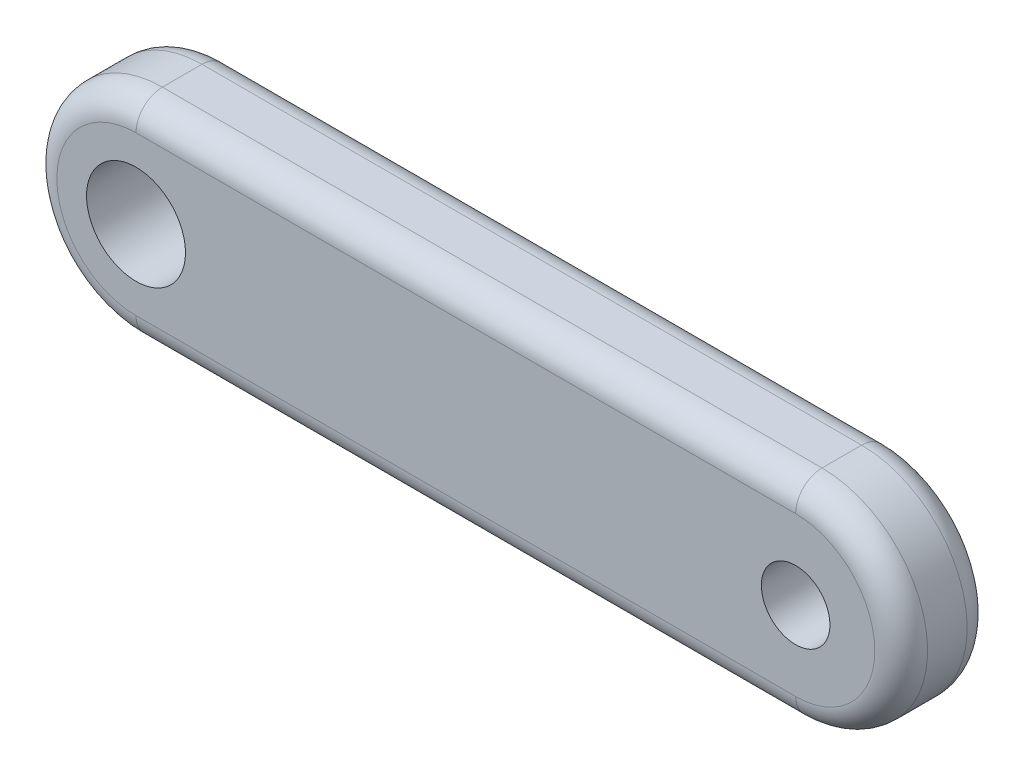
ISO-10303-21;
HEADER;
FILE_DESCRIPTION(('STEP AP214'),'2;1');
FILE_NAME('part.step','',(''),(''),'','','');
FILE_SCHEMA(('AUTOMOTIVE_DESIGN { 1 0 10303 214 1 1 1 1 }'));
ENDSEC;
DATA;
#1=APPLICATION_CONTEXT('core data for automotive mechanical design processes');
#2=APPLICATION_PROTOCOL_DEFINITION('international standard','automotive_design',2000,#1);
#3=PRODUCT_CONTEXT('',#1,'mechanical');
#4=PRODUCT('Part','Part','',(#3));
#5=PRODUCT_RELATED_PRODUCT_CATEGORY('part','',(#4));
#6=PRODUCT_DEFINITION_FORMATION('','',#4);
#7=PRODUCT_DEFINITION_CONTEXT('part definition',#1,'design');
#8=PRODUCT_DEFINITION('design','',#6,#7);
#9=PRODUCT_DEFINITION_SHAPE('','',#8);
#10=(LENGTH_UNIT() NAMED_UNIT(*) SI_UNIT(.MILLI.,.METRE.));
#11=(NAMED_UNIT(*) PLANE_ANGLE_UNIT() SI_UNIT($,.RADIAN.));
#12=(NAMED_UNIT(*) SI_UNIT($,.STERADIAN.) SOLID_ANGLE_UNIT());
#13=UNCERTAINTY_MEASURE_WITH_UNIT(LENGTH_MEASURE(1.E-05),#10,'distance_accuracy_value','');
#14=(GEOMETRIC_REPRESENTATION_CONTEXT(3) GLOBAL_UNCERTAINTY_ASSIGNED_CONTEXT((#13)) GLOBAL_UNIT_ASSIGNED_CONTEXT((#10,
#11,#12)) REPRESENTATION_CONTEXT('',''));
#15=CARTESIAN_POINT('',(0.,0.,0.));
#16=DIRECTION('',(0.,0.,1.));
#17=DIRECTION('',(1.,0.,0.));
#18=AXIS2_PLACEMENT_3D('',#15,#16,#17);
#19=CARTESIAN_POINT('',(0.,0.,4.445));
#20=DIRECTION('',(0.,0.,1.));
#21=DIRECTION('',(1.,0.,0.));
#22=AXIS2_PLACEMENT_3D('',#19,#20,#21);
#23=PLANE('',#22);
#24=DIRECTION('',(1.,0.,0.));
#25=VECTOR('',#24,1.);
#26=CARTESIAN_POINT('',(31.75,-3.81,4.445));
#27=LINE('',#26,#25);
#28=CARTESIAN_POINT('',(0.,-3.81,4.445));
#29=VERTEX_POINT('',#28);
#30=CARTESIAN_POINT('',(31.75,-3.81,4.445));
#31=VERTEX_POINT('',#30);
#32=EDGE_CURVE('E57',#29,#31,#27,.T.);
#33=ORIENTED_EDGE('',*,*,#32,.T.);
#34=CARTESIAN_POINT('',(31.75,0.,4.445));
#35=DIRECTION('',(0.,0.,1.));
#36=DIRECTION('',(1.,0.,0.));
#37=AXIS2_PLACEMENT_3D('',#34,#35,#36);
#38=CIRCLE('',#37,3.81);
#39=CARTESIAN_POINT('',(31.75,3.81,4.445));
#40=VERTEX_POINT('',#39);
#41=EDGE_CURVE('E117',#31,#40,#38,.T.);
#42=ORIENTED_EDGE('',*,*,#41,.T.);
#43=DIRECTION('',(-1.,0.,0.));
#44=VECTOR('',#43,1.);
#45=CARTESIAN_POINT('',(0.,3.81,4.445));
#46=LINE('',#45,#44);
#47=CARTESIAN_POINT('',(0.,3.81,4.445));
#48=VERTEX_POINT('',#47);
#49=EDGE_CURVE('E143',#40,#48,#46,.T.);
#50=ORIENTED_EDGE('',*,*,#49,.T.);
#51=CARTESIAN_POINT('',(0.,0.,4.445));
#52=DIRECTION('',(0.,0.,1.));
#53=DIRECTION('',(1.,0.,0.));
#54=AXIS2_PLACEMENT_3D('',#51,#52,#53);
#55=CIRCLE('',#54,3.81);
#56=EDGE_CURVE('E62',#48,#29,#55,.T.);
#57=ORIENTED_EDGE('',*,*,#56,.T.);
#58=EDGE_LOOP('',(#33,#42,#50,#57));
#59=FACE_BOUND('',#58,.T.);
#60=CARTESIAN_POINT('',(0.,0.,4.445));
#61=DIRECTION('',(0.,0.,1.));
#62=DIRECTION('',(1.,0.,0.));
#63=AXIS2_PLACEMENT_3D('',#60,#61,#62);
#64=CIRCLE('',#63,2.38125);
#65=CARTESIAN_POINT('',(2.38125,0.,4.445));
#66=VERTEX_POINT('',#65);
#67=EDGE_CURVE('E190',#66,#66,#64,.T.);
#68=ORIENTED_EDGE('',*,*,#67,.F.);
#69=EDGE_LOOP('',(#68));
#70=FACE_BOUND('',#69,.T.);
#71=CARTESIAN_POINT('',(31.75,0.,4.445));
#72=DIRECTION('',(0.,0.,1.));
#73=DIRECTION('',(1.,0.,0.));
#74=AXIS2_PLACEMENT_3D('',#71,#72,#73);
#75=CIRCLE('',#74,1.651);
#76=CARTESIAN_POINT('',(33.401,0.,4.445));
#77=VERTEX_POINT('',#76);
#78=EDGE_CURVE('E181',#77,#77,#75,.T.);
#79=ORIENTED_EDGE('',*,*,#78,.F.);
#80=EDGE_LOOP('',(#79));
#81=FACE_BOUND('',#80,.T.);
#82=ADVANCED_FACE('F39',(#59,#70,#81),#23,.T.);
#83=CARTESIAN_POINT('',(0.,0.,0.));
#84=DIRECTION('',(0.,0.,1.));
#85=DIRECTION('',(1.,0.,0.));
#86=AXIS2_PLACEMENT_3D('',#83,#84,#85);
#87=PLANE('',#86);
#88=DIRECTION('',(-1.,0.,0.));
#89=VECTOR('',#88,1.);
#90=CARTESIAN_POINT('',(0.,3.81,0.));
#91=LINE('',#90,#89);
#92=CARTESIAN_POINT('',(0.,3.81,0.));
#93=VERTEX_POINT('',#92);
#94=CARTESIAN_POINT('',(31.75,3.81,0.));
#95=VERTEX_POINT('',#94);
#96=EDGE_CURVE('E206',#93,#95,#91,.F.);
#97=ORIENTED_EDGE('',*,*,#96,.T.);
#98=CARTESIAN_POINT('',(31.75,0.,0.));
#99=DIRECTION('',(0.,0.,1.));
#100=DIRECTION('',(1.,0.,0.));
#101=AXIS2_PLACEMENT_3D('',#98,#99,#100);
#102=CIRCLE('',#101,3.81);
#103=CARTESIAN_POINT('',(31.75,-3.81,0.));
#104=VERTEX_POINT('',#103);
#105=EDGE_CURVE('E215',#95,#104,#102,.F.);
#106=ORIENTED_EDGE('',*,*,#105,.T.);
#107=DIRECTION('',(1.,0.,0.));
#108=VECTOR('',#107,1.);
#109=CARTESIAN_POINT('',(0.,-3.81,0.));
#110=LINE('',#109,#108);
#111=CARTESIAN_POINT('',(0.,-3.81,0.));
#112=VERTEX_POINT('',#111);
#113=EDGE_CURVE('E212',#104,#112,#110,.F.);
#114=ORIENTED_EDGE('',*,*,#113,.T.);
#115=CARTESIAN_POINT('',(0.,0.,0.));
#116=DIRECTION('',(0.,0.,1.));
#117=DIRECTION('',(1.,0.,0.));
#118=AXIS2_PLACEMENT_3D('',#115,#116,#117);
#119=CIRCLE('',#118,3.81);
#120=EDGE_CURVE('E209',#112,#93,#119,.F.);
#121=ORIENTED_EDGE('',*,*,#120,.T.);
#122=EDGE_LOOP('',(#97,#106,#114,#121));
#123=FACE_BOUND('',#122,.T.);
#124=CARTESIAN_POINT('',(0.,0.,0.));
#125=DIRECTION('',(0.,0.,1.));
#126=DIRECTION('',(1.,0.,0.));
#127=AXIS2_PLACEMENT_3D('',#124,#125,#126);
#128=CIRCLE('',#127,2.38125);
#129=CARTESIAN_POINT('',(2.38125,0.,0.));
#130=VERTEX_POINT('',#129);
#131=EDGE_CURVE('E187',#130,#130,#128,.T.);
#132=ORIENTED_EDGE('',*,*,#131,.T.);
#133=EDGE_LOOP('',(#132));
#134=FACE_BOUND('',#133,.T.);
#135=CARTESIAN_POINT('',(31.75,0.,0.));
#136=DIRECTION('',(0.,0.,1.));
#137=DIRECTION('',(1.,0.,0.));
#138=AXIS2_PLACEMENT_3D('',#135,#136,#137);
#139=CIRCLE('',#138,1.651);
#140=CARTESIAN_POINT('',(33.401,0.,0.));
#141=VERTEX_POINT('',#140);
#142=EDGE_CURVE('E174',#141,#141,#139,.T.);
#143=ORIENTED_EDGE('',*,*,#142,.T.);
#144=EDGE_LOOP('',(#143));
#145=FACE_BOUND('',#144,.T.);
#146=ADVANCED_FACE('F264',(#123,#134,#145),#87,.F.);
#147=CARTESIAN_POINT('',(0.,0.,4.445));
#148=DIRECTION('',(0.,0.,-1.));
#149=DIRECTION('',(-1.,0.,0.));
#150=AXIS2_PLACEMENT_3D('',#147,#148,#149);
#151=CYLINDRICAL_SURFACE('',#150,5.08);
#152=DIRECTION('',(0.,0.,-1.));
#153=VECTOR('',#152,1.);
#154=CARTESIAN_POINT('',(0.,5.08,4.445));
#155=LINE('',#154,#153);
#156=CARTESIAN_POINT('',(0.,5.08,3.175));
#157=VERTEX_POINT('',#156);
#158=CARTESIAN_POINT('',(0.,5.08,1.27));
#159=VERTEX_POINT('',#158);
#160=EDGE_CURVE('E111',#157,#159,#155,.T.);
#161=ORIENTED_EDGE('',*,*,#160,.T.);
#162=CARTESIAN_POINT('',(0.,0.,1.27));
#163=DIRECTION('',(0.,0.,1.));
#164=DIRECTION('',(1.,0.,0.));
#165=AXIS2_PLACEMENT_3D('',#162,#163,#164);
#166=CIRCLE('',#165,5.08);
#167=CARTESIAN_POINT('',(0.,-5.08,1.27));
#168=VERTEX_POINT('',#167);
#169=EDGE_CURVE('E228',#159,#168,#166,.T.);
#170=ORIENTED_EDGE('',*,*,#169,.T.);
#171=DIRECTION('',(0.,0.,-1.));
#172=VECTOR('',#171,1.);
#173=CARTESIAN_POINT('',(0.,-5.08,4.445));
#174=LINE('',#173,#172);
#175=CARTESIAN_POINT('',(0.,-5.08,3.175));
#176=VERTEX_POINT('',#175);
#177=EDGE_CURVE('E140',#176,#168,#174,.T.);
#178=ORIENTED_EDGE('',*,*,#177,.F.);
#179=CARTESIAN_POINT('',(0.,0.,3.175));
#180=DIRECTION('',(0.,0.,1.));
#181=DIRECTION('',(1.,0.,0.));
#182=AXIS2_PLACEMENT_3D('',#179,#180,#181);
#183=CIRCLE('',#182,5.08);
#184=EDGE_CURVE('E225',#176,#157,#183,.F.);
#185=ORIENTED_EDGE('',*,*,#184,.T.);
#186=EDGE_LOOP('',(#161,#170,#178,#185));
#187=FACE_BOUND('',#186,.T.);
#188=ADVANCED_FACE('F246',(#187),#151,.T.);
#189=CARTESIAN_POINT('',(0.,-5.08,4.445));
#190=DIRECTION('',(0.,1.,0.));
#191=DIRECTION('',(0.,0.,1.));
#192=AXIS2_PLACEMENT_3D('',#189,#190,#191);
#193=PLANE('',#192);
#194=ORIENTED_EDGE('',*,*,#177,.T.);
#195=DIRECTION('',(1.,0.,0.));
#196=VECTOR('',#195,1.);
#197=CARTESIAN_POINT('',(0.,-5.08,1.27));
#198=LINE('',#197,#196);
#199=CARTESIAN_POINT('',(31.75,-5.08,1.27));
#200=VERTEX_POINT('',#199);
#201=EDGE_CURVE('E222',#168,#200,#198,.T.);
#202=ORIENTED_EDGE('',*,*,#201,.T.);
#203=DIRECTION('',(0.,0.,-1.));
#204=VECTOR('',#203,1.);
#205=CARTESIAN_POINT('',(31.75,-5.08,4.445));
#206=LINE('',#205,#204);
#207=CARTESIAN_POINT('',(31.75,-5.08,3.175));
#208=VERTEX_POINT('',#207);
#209=EDGE_CURVE('E130',#208,#200,#206,.T.);
#210=ORIENTED_EDGE('',*,*,#209,.F.);
#211=DIRECTION('',(1.,0.,0.));
#212=VECTOR('',#211,1.);
#213=CARTESIAN_POINT('',(0.,-5.08,3.175));
#214=LINE('',#213,#212);
#215=EDGE_CURVE('E219',#208,#176,#214,.F.);
#216=ORIENTED_EDGE('',*,*,#215,.T.);
#217=EDGE_LOOP('',(#194,#202,#210,#216));
#218=FACE_BOUND('',#217,.T.);
#219=ADVANCED_FACE('F244',(#218),#193,.F.);
#220=CARTESIAN_POINT('',(31.75,0.,4.445));
#221=DIRECTION('',(0.,0.,-1.));
#222=DIRECTION('',(-1.,0.,0.));
#223=AXIS2_PLACEMENT_3D('',#220,#221,#222);
#224=CYLINDRICAL_SURFACE('',#223,5.08);
#225=ORIENTED_EDGE('',*,*,#209,.T.);
#226=CARTESIAN_POINT('',(31.75,0.,1.27));
#227=DIRECTION('',(0.,0.,1.));
#228=DIRECTION('',(1.,0.,0.));
#229=AXIS2_PLACEMENT_3D('',#226,#227,#228);
#230=CIRCLE('',#229,5.08);
#231=CARTESIAN_POINT('',(31.75,5.08,1.27));
#232=VERTEX_POINT('',#231);
#233=EDGE_CURVE('E128',#200,#232,#230,.T.);
#234=ORIENTED_EDGE('',*,*,#233,.T.);
#235=DIRECTION('',(0.,0.,-1.));
#236=VECTOR('',#235,1.);
#237=CARTESIAN_POINT('',(31.75,5.08,4.445));
#238=LINE('',#237,#236);
#239=CARTESIAN_POINT('',(31.75,5.08,3.175));
#240=VERTEX_POINT('',#239);
#241=EDGE_CURVE('E109',#240,#232,#238,.T.);
#242=ORIENTED_EDGE('',*,*,#241,.F.);
#243=CARTESIAN_POINT('',(31.75,0.,3.175));
#244=DIRECTION('',(0.,0.,1.));
#245=DIRECTION('',(1.,0.,0.));
#246=AXIS2_PLACEMENT_3D('',#243,#244,#245);
#247=CIRCLE('',#246,5.08);
#248=EDGE_CURVE('E125',#240,#208,#247,.F.);
#249=ORIENTED_EDGE('',*,*,#248,.T.);
#250=EDGE_LOOP('',(#225,#234,#242,#249));
#251=FACE_BOUND('',#250,.T.);
#252=ADVANCED_FACE('F124',(#251),#224,.T.);
#253=CARTESIAN_POINT('',(0.,5.08,4.445));
#254=DIRECTION('',(0.,-1.,0.));
#255=DIRECTION('',(0.,0.,-1.));
#256=AXIS2_PLACEMENT_3D('',#253,#254,#255);
#257=PLANE('',#256);
#258=ORIENTED_EDGE('',*,*,#241,.T.);
#259=DIRECTION('',(-1.,0.,0.));
#260=VECTOR('',#259,1.);
#261=CARTESIAN_POINT('',(0.,5.08,1.27));
#262=LINE('',#261,#260);
#263=EDGE_CURVE('E11',#232,#159,#262,.T.);
#264=ORIENTED_EDGE('',*,*,#263,.T.);
#265=ORIENTED_EDGE('',*,*,#160,.F.);
#266=DIRECTION('',(-1.,0.,0.));
#267=VECTOR('',#266,1.);
#268=CARTESIAN_POINT('',(31.75,5.08,3.175));
#269=LINE('',#268,#267);
#270=EDGE_CURVE('E49',#157,#240,#269,.F.);
#271=ORIENTED_EDGE('',*,*,#270,.T.);
#272=EDGE_LOOP('',(#258,#264,#265,#271));
#273=FACE_BOUND('',#272,.T.);
#274=ADVANCED_FACE('F108',(#273),#257,.F.);
#275=CARTESIAN_POINT('',(0.,0.,4.445));
#276=DIRECTION('',(0.,0.,-1.));
#277=DIRECTION('',(-1.,0.,0.));
#278=AXIS2_PLACEMENT_3D('',#275,#276,#277);
#279=CYLINDRICAL_SURFACE('',#278,2.38125);
#280=ORIENTED_EDGE('',*,*,#67,.T.);
#281=EDGE_LOOP('',(#280));
#282=FACE_BOUND('',#281,.T.);
#283=ORIENTED_EDGE('',*,*,#131,.F.);
#284=EDGE_LOOP('',(#283));
#285=FACE_BOUND('',#284,.T.);
#286=ADVANCED_FACE('F272',(#282,#285),#279,.F.);
#287=CARTESIAN_POINT('',(31.75,0.,4.445));
#288=DIRECTION('',(0.,0.,-1.));
#289=DIRECTION('',(-1.,0.,0.));
#290=AXIS2_PLACEMENT_3D('',#287,#288,#289);
#291=CYLINDRICAL_SURFACE('',#290,1.651);
#292=ORIENTED_EDGE('',*,*,#78,.T.);
#293=EDGE_LOOP('',(#292));
#294=FACE_BOUND('',#293,.T.);
#295=ORIENTED_EDGE('',*,*,#142,.F.);
#296=EDGE_LOOP('',(#295));
#297=FACE_BOUND('',#296,.T.);
#298=ADVANCED_FACE('F304',(#294,#297),#291,.F.);
#299=CARTESIAN_POINT('',(0.,0.,1.27));
#300=DIRECTION('',(0.,0.,1.));
#301=DIRECTION('',(1.,0.,0.));
#302=AXIS2_PLACEMENT_3D('',#299,#300,#301);
#303=TOROIDAL_SURFACE('',#302,3.81,1.27);
#304=CARTESIAN_POINT('',(0.,3.81,1.27));
#305=DIRECTION('',(1.,0.,0.));
#306=DIRECTION('',(0.,0.,-1.));
#307=AXIS2_PLACEMENT_3D('',#304,#305,#306);
#308=CIRCLE('',#307,1.27);
#309=EDGE_CURVE('E165',#93,#159,#308,.T.);
#310=ORIENTED_EDGE('',*,*,#309,.F.);
#311=ORIENTED_EDGE('',*,*,#120,.F.);
#312=CARTESIAN_POINT('',(0.,-3.81,1.27));
#313=DIRECTION('',(1.,0.,0.));
#314=DIRECTION('',(0.,0.,-1.));
#315=AXIS2_PLACEMENT_3D('',#312,#313,#314);
#316=CIRCLE('',#315,1.27);
#317=EDGE_CURVE('E150',#168,#112,#316,.T.);
#318=ORIENTED_EDGE('',*,*,#317,.F.);
#319=ORIENTED_EDGE('',*,*,#169,.F.);
#320=EDGE_LOOP('',(#310,#311,#318,#319));
#321=FACE_BOUND('',#320,.T.);
#322=ADVANCED_FACE('F249',(#321),#303,.T.);
#323=CARTESIAN_POINT('',(0.,-3.81,1.27));
#324=DIRECTION('',(1.,0.,0.));
#325=DIRECTION('',(0.,0.,-1.));
#326=AXIS2_PLACEMENT_3D('',#323,#324,#325);
#327=CYLINDRICAL_SURFACE('',#326,1.27);
#328=ORIENTED_EDGE('',*,*,#317,.T.);
#329=ORIENTED_EDGE('',*,*,#113,.F.);
#330=CARTESIAN_POINT('',(31.75,-3.81,1.27));
#331=DIRECTION('',(1.,0.,0.));
#332=DIRECTION('',(0.,0.,-1.));
#333=AXIS2_PLACEMENT_3D('',#330,#331,#332);
#334=CIRCLE('',#333,1.27);
#335=EDGE_CURVE('E158',#200,#104,#334,.T.);
#336=ORIENTED_EDGE('',*,*,#335,.F.);
#337=ORIENTED_EDGE('',*,*,#201,.F.);
#338=EDGE_LOOP('',(#328,#329,#336,#337));
#339=FACE_BOUND('',#338,.T.);
#340=ADVANCED_FACE('F252',(#339),#327,.T.);
#341=CARTESIAN_POINT('',(0.,3.81,1.27));
#342=DIRECTION('',(-1.,0.,0.));
#343=DIRECTION('',(0.,0.,1.));
#344=AXIS2_PLACEMENT_3D('',#341,#342,#343);
#345=CYLINDRICAL_SURFACE('',#344,1.27);
#346=ORIENTED_EDGE('',*,*,#309,.T.);
#347=ORIENTED_EDGE('',*,*,#263,.F.);
#348=CARTESIAN_POINT('',(31.75,3.81,1.27));
#349=DIRECTION('',(1.,0.,0.));
#350=DIRECTION('',(0.,0.,-1.));
#351=AXIS2_PLACEMENT_3D('',#348,#349,#350);
#352=CIRCLE('',#351,1.27);
#353=EDGE_CURVE('E155',#95,#232,#352,.T.);
#354=ORIENTED_EDGE('',*,*,#353,.F.);
#355=ORIENTED_EDGE('',*,*,#96,.F.);
#356=EDGE_LOOP('',(#346,#347,#354,#355));
#357=FACE_BOUND('',#356,.T.);
#358=ADVANCED_FACE('F255',(#357),#345,.T.);
#359=CARTESIAN_POINT('',(31.75,0.,1.27));
#360=DIRECTION('',(0.,0.,1.));
#361=DIRECTION('',(1.,0.,0.));
#362=AXIS2_PLACEMENT_3D('',#359,#360,#361);
#363=TOROIDAL_SURFACE('',#362,3.81,1.27);
#364=ORIENTED_EDGE('',*,*,#335,.T.);
#365=ORIENTED_EDGE('',*,*,#105,.F.);
#366=ORIENTED_EDGE('',*,*,#353,.T.);
#367=ORIENTED_EDGE('',*,*,#233,.F.);
#368=EDGE_LOOP('',(#364,#365,#366,#367));
#369=FACE_BOUND('',#368,.T.);
#370=ADVANCED_FACE('F253',(#369),#363,.T.);
#371=CARTESIAN_POINT('',(0.,0.,3.175));
#372=DIRECTION('',(0.,0.,1.));
#373=DIRECTION('',(1.,0.,0.));
#374=AXIS2_PLACEMENT_3D('',#371,#372,#373);
#375=TOROIDAL_SURFACE('',#374,3.81,1.27);
#376=CARTESIAN_POINT('',(0.,3.81,3.175));
#377=DIRECTION('',(1.,0.,0.));
#378=DIRECTION('',(0.,0.,-1.));
#379=AXIS2_PLACEMENT_3D('',#376,#377,#378);
#380=CIRCLE('',#379,1.27);
#381=EDGE_CURVE('E147',#157,#48,#380,.T.);
#382=ORIENTED_EDGE('',*,*,#381,.F.);
#383=ORIENTED_EDGE('',*,*,#184,.F.);
#384=CARTESIAN_POINT('',(0.,-3.81,3.175));
#385=DIRECTION('',(1.,0.,0.));
#386=DIRECTION('',(0.,0.,-1.));
#387=AXIS2_PLACEMENT_3D('',#384,#385,#386);
#388=CIRCLE('',#387,1.27);
#389=EDGE_CURVE('E43',#29,#176,#388,.T.);
#390=ORIENTED_EDGE('',*,*,#389,.F.);
#391=ORIENTED_EDGE('',*,*,#56,.F.);
#392=EDGE_LOOP('',(#382,#383,#390,#391));
#393=FACE_BOUND('',#392,.T.);
#394=ADVANCED_FACE('F41',(#393),#375,.T.);
#395=CARTESIAN_POINT('',(0.,-3.81,3.175));
#396=DIRECTION('',(-1.,0.,0.));
#397=DIRECTION('',(0.,0.,1.));
#398=AXIS2_PLACEMENT_3D('',#395,#396,#397);
#399=CYLINDRICAL_SURFACE('',#398,1.27);
#400=ORIENTED_EDGE('',*,*,#389,.T.);
#401=ORIENTED_EDGE('',*,*,#215,.F.);
#402=CARTESIAN_POINT('',(31.75,-3.81,3.175));
#403=DIRECTION('',(1.,0.,0.));
#404=DIRECTION('',(0.,0.,-1.));
#405=AXIS2_PLACEMENT_3D('',#402,#403,#404);
#406=CIRCLE('',#405,1.27);
#407=EDGE_CURVE('E137',#31,#208,#406,.T.);
#408=ORIENTED_EDGE('',*,*,#407,.F.);
#409=ORIENTED_EDGE('',*,*,#32,.F.);
#410=EDGE_LOOP('',(#400,#401,#408,#409));
#411=FACE_BOUND('',#410,.T.);
#412=ADVANCED_FACE('F241',(#411),#399,.T.);
#413=CARTESIAN_POINT('',(0.,3.81,3.175));
#414=DIRECTION('',(1.,0.,0.));
#415=DIRECTION('',(0.,0.,-1.));
#416=AXIS2_PLACEMENT_3D('',#413,#414,#415);
#417=CYLINDRICAL_SURFACE('',#416,1.27);
#418=ORIENTED_EDGE('',*,*,#381,.T.);
#419=ORIENTED_EDGE('',*,*,#49,.F.);
#420=CARTESIAN_POINT('',(31.75,3.81,3.175));
#421=DIRECTION('',(1.,0.,0.));
#422=DIRECTION('',(0.,0.,-1.));
#423=AXIS2_PLACEMENT_3D('',#420,#421,#422);
#424=CIRCLE('',#423,1.27);
#425=EDGE_CURVE('E135',#240,#40,#424,.T.);
#426=ORIENTED_EDGE('',*,*,#425,.F.);
#427=ORIENTED_EDGE('',*,*,#270,.F.);
#428=EDGE_LOOP('',(#418,#419,#426,#427));
#429=FACE_BOUND('',#428,.T.);
#430=ADVANCED_FACE('F142',(#429),#417,.T.);
#431=CARTESIAN_POINT('',(31.75,0.,3.175));
#432=DIRECTION('',(0.,0.,1.));
#433=DIRECTION('',(1.,0.,0.));
#434=AXIS2_PLACEMENT_3D('',#431,#432,#433);
#435=TOROIDAL_SURFACE('',#434,3.81,1.27);
#436=ORIENTED_EDGE('',*,*,#407,.T.);
#437=ORIENTED_EDGE('',*,*,#248,.F.);
#438=ORIENTED_EDGE('',*,*,#425,.T.);
#439=ORIENTED_EDGE('',*,*,#41,.F.);
#440=EDGE_LOOP('',(#436,#437,#438,#439));
#441=FACE_BOUND('',#440,.T.);
#442=ADVANCED_FACE('F133',(#441),#435,.T.);
#443=CLOSED_SHELL('',(#82,#146,#188,#219,#252,#274,#286,#298,#322,#340,#358,#370,#394,#412,#430,#442));
#444=MANIFOLD_SOLID_BREP('B2',#443);
#445=ADVANCED_BREP_SHAPE_REPRESENTATION('',(#18,#444),#14);
#446=SHAPE_DEFINITION_REPRESENTATION(#9,#445);
ENDSEC;
END-ISO-10303-21;
